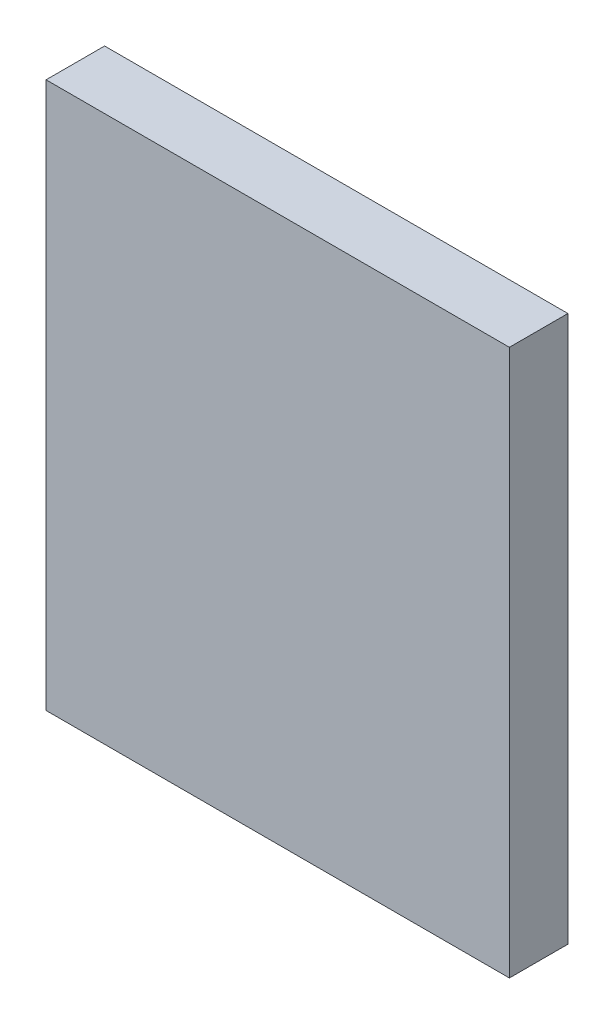
ISO-10303-21;
HEADER;
FILE_DESCRIPTION(('STEP AP214'),'2;1');
FILE_NAME('part.step','',(''),(''),'','','');
FILE_SCHEMA(('AUTOMOTIVE_DESIGN { 1 0 10303 214 1 1 1 1 }'));
ENDSEC;
DATA;
#1=APPLICATION_CONTEXT('core data for automotive mechanical design processes');
#2=APPLICATION_PROTOCOL_DEFINITION('international standard','automotive_design',2000,#1);
#3=PRODUCT_CONTEXT('',#1,'mechanical');
#4=PRODUCT('Part','Part','',(#3));
#5=PRODUCT_RELATED_PRODUCT_CATEGORY('part','',(#4));
#6=PRODUCT_DEFINITION_FORMATION('','',#4);
#7=PRODUCT_DEFINITION_CONTEXT('part definition',#1,'design');
#8=PRODUCT_DEFINITION('design','',#6,#7);
#9=PRODUCT_DEFINITION_SHAPE('','',#8);
#10=(LENGTH_UNIT() NAMED_UNIT(*) SI_UNIT(.MILLI.,.METRE.));
#11=(NAMED_UNIT(*) PLANE_ANGLE_UNIT() SI_UNIT($,.RADIAN.));
#12=(NAMED_UNIT(*) SI_UNIT($,.STERADIAN.) SOLID_ANGLE_UNIT());
#13=UNCERTAINTY_MEASURE_WITH_UNIT(LENGTH_MEASURE(1.E-05),#10,'distance_accuracy_value','');
#14=(GEOMETRIC_REPRESENTATION_CONTEXT(3) GLOBAL_UNCERTAINTY_ASSIGNED_CONTEXT((#13)) GLOBAL_UNIT_ASSIGNED_CONTEXT((#10,
#11,#12)) REPRESENTATION_CONTEXT('',''));
#15=CARTESIAN_POINT('',(0.,0.,0.));
#16=DIRECTION('',(0.,0.,1.));
#17=DIRECTION('',(1.,0.,0.));
#18=AXIS2_PLACEMENT_3D('',#15,#16,#17);
#19=CARTESIAN_POINT('',(0.,0.,1.2));
#20=DIRECTION('',(1.,0.,0.));
#21=DIRECTION('',(0.,0.,-1.));
#22=AXIS2_PLACEMENT_3D('',#19,#20,#21);
#23=PLANE('',#22);
#24=DIRECTION('',(0.,-1.,0.));
#25=VECTOR('',#24,1.);
#26=CARTESIAN_POINT('',(0.,0.,0.));
#27=LINE('',#26,#25);
#28=CARTESIAN_POINT('',(0.,11.2,0.));
#29=VERTEX_POINT('',#28);
#30=CARTESIAN_POINT('',(0.,0.,0.));
#31=VERTEX_POINT('',#30);
#32=EDGE_CURVE('E95',#29,#31,#27,.T.);
#33=ORIENTED_EDGE('',*,*,#32,.T.);
#34=DIRECTION('',(0.,0.,-1.));
#35=VECTOR('',#34,1.);
#36=CARTESIAN_POINT('',(0.,0.,1.2));
#37=LINE('',#36,#35);
#38=CARTESIAN_POINT('',(0.,0.,1.2));
#39=VERTEX_POINT('',#38);
#40=EDGE_CURVE('E11',#39,#31,#37,.T.);
#41=ORIENTED_EDGE('',*,*,#40,.F.);
#42=DIRECTION('',(0.,-1.,0.));
#43=VECTOR('',#42,1.);
#44=CARTESIAN_POINT('',(0.,0.,1.2));
#45=LINE('',#44,#43);
#46=CARTESIAN_POINT('',(0.,11.2,1.2));
#47=VERTEX_POINT('',#46);
#48=EDGE_CURVE('E83',#47,#39,#45,.T.);
#49=ORIENTED_EDGE('',*,*,#48,.F.);
#50=DIRECTION('',(0.,0.,-1.));
#51=VECTOR('',#50,1.);
#52=CARTESIAN_POINT('',(0.,11.2,1.2));
#53=LINE('',#52,#51);
#54=EDGE_CURVE('E91',#47,#29,#53,.T.);
#55=ORIENTED_EDGE('',*,*,#54,.T.);
#56=EDGE_LOOP('',(#33,#41,#49,#55));
#57=FACE_BOUND('',#56,.T.);
#58=ADVANCED_FACE('F32',(#57),#23,.F.);
#59=CARTESIAN_POINT('',(0.,0.,1.2));
#60=DIRECTION('',(0.,1.,0.));
#61=DIRECTION('',(0.,0.,1.));
#62=AXIS2_PLACEMENT_3D('',#59,#60,#61);
#63=PLANE('',#62);
#64=DIRECTION('',(1.,0.,0.));
#65=VECTOR('',#64,1.);
#66=CARTESIAN_POINT('',(0.,0.,0.));
#67=LINE('',#66,#65);
#68=CARTESIAN_POINT('',(9.5,0.,0.));
#69=VERTEX_POINT('',#68);
#70=EDGE_CURVE('E87',#31,#69,#67,.T.);
#71=ORIENTED_EDGE('',*,*,#70,.T.);
#72=DIRECTION('',(0.,0.,-1.));
#73=VECTOR('',#72,1.);
#74=CARTESIAN_POINT('',(9.5,0.,1.2));
#75=LINE('',#74,#73);
#76=CARTESIAN_POINT('',(9.5,0.,1.2));
#77=VERTEX_POINT('',#76);
#78=EDGE_CURVE('E40',#77,#69,#75,.T.);
#79=ORIENTED_EDGE('',*,*,#78,.F.);
#80=DIRECTION('',(1.,0.,0.));
#81=VECTOR('',#80,1.);
#82=CARTESIAN_POINT('',(0.,0.,1.2));
#83=LINE('',#82,#81);
#84=EDGE_CURVE('E78',#39,#77,#83,.T.);
#85=ORIENTED_EDGE('',*,*,#84,.F.);
#86=ORIENTED_EDGE('',*,*,#40,.T.);
#87=EDGE_LOOP('',(#71,#79,#85,#86));
#88=FACE_BOUND('',#87,.T.);
#89=ADVANCED_FACE('F86',(#88),#63,.F.);
#90=CARTESIAN_POINT('',(9.5,0.,1.2));
#91=DIRECTION('',(-1.,0.,0.));
#92=DIRECTION('',(0.,0.,1.));
#93=AXIS2_PLACEMENT_3D('',#90,#91,#92);
#94=PLANE('',#93);
#95=DIRECTION('',(0.,1.,0.));
#96=VECTOR('',#95,1.);
#97=CARTESIAN_POINT('',(9.5,0.,0.));
#98=LINE('',#97,#96);
#99=CARTESIAN_POINT('',(9.5,11.2,0.));
#100=VERTEX_POINT('',#99);
#101=EDGE_CURVE('E65',#69,#100,#98,.T.);
#102=ORIENTED_EDGE('',*,*,#101,.T.);
#103=DIRECTION('',(0.,0.,-1.));
#104=VECTOR('',#103,1.);
#105=CARTESIAN_POINT('',(9.5,11.2,1.2));
#106=LINE('',#105,#104);
#107=CARTESIAN_POINT('',(9.5,11.2,1.2));
#108=VERTEX_POINT('',#107);
#109=EDGE_CURVE('E88',#108,#100,#106,.T.);
#110=ORIENTED_EDGE('',*,*,#109,.F.);
#111=DIRECTION('',(0.,1.,0.));
#112=VECTOR('',#111,1.);
#113=CARTESIAN_POINT('',(9.5,0.,1.2));
#114=LINE('',#113,#112);
#115=EDGE_CURVE('E81',#77,#108,#114,.T.);
#116=ORIENTED_EDGE('',*,*,#115,.F.);
#117=ORIENTED_EDGE('',*,*,#78,.T.);
#118=EDGE_LOOP('',(#102,#110,#116,#117));
#119=FACE_BOUND('',#118,.T.);
#120=ADVANCED_FACE('F89',(#119),#94,.F.);
#121=CARTESIAN_POINT('',(0.,11.2,1.2));
#122=DIRECTION('',(0.,-1.,0.));
#123=DIRECTION('',(0.,0.,-1.));
#124=AXIS2_PLACEMENT_3D('',#121,#122,#123);
#125=PLANE('',#124);
#126=DIRECTION('',(-1.,0.,0.));
#127=VECTOR('',#126,1.);
#128=CARTESIAN_POINT('',(0.,11.2,0.));
#129=LINE('',#128,#127);
#130=EDGE_CURVE('E71',#100,#29,#129,.T.);
#131=ORIENTED_EDGE('',*,*,#130,.T.);
#132=ORIENTED_EDGE('',*,*,#54,.F.);
#133=DIRECTION('',(-1.,0.,0.));
#134=VECTOR('',#133,1.);
#135=CARTESIAN_POINT('',(0.,11.2,1.2));
#136=LINE('',#135,#134);
#137=EDGE_CURVE('E48',#108,#47,#136,.T.);
#138=ORIENTED_EDGE('',*,*,#137,.F.);
#139=ORIENTED_EDGE('',*,*,#109,.T.);
#140=EDGE_LOOP('',(#131,#132,#138,#139));
#141=FACE_BOUND('',#140,.T.);
#142=ADVANCED_FACE('F102',(#141),#125,.F.);
#143=CARTESIAN_POINT('',(0.,0.,1.2));
#144=DIRECTION('',(0.,0.,-1.));
#145=DIRECTION('',(-1.,0.,0.));
#146=AXIS2_PLACEMENT_3D('',#143,#144,#145);
#147=PLANE('',#146);
#148=ORIENTED_EDGE('',*,*,#48,.T.);
#149=ORIENTED_EDGE('',*,*,#84,.T.);
#150=ORIENTED_EDGE('',*,*,#115,.T.);
#151=ORIENTED_EDGE('',*,*,#137,.T.);
#152=EDGE_LOOP('',(#148,#149,#150,#151));
#153=FACE_BOUND('',#152,.T.);
#154=ADVANCED_FACE('F79',(#153),#147,.F.);
#155=CARTESIAN_POINT('',(0.,0.,0.));
#156=DIRECTION('',(0.,0.,-1.));
#157=DIRECTION('',(-1.,0.,0.));
#158=AXIS2_PLACEMENT_3D('',#155,#156,#157);
#159=PLANE('',#158);
#160=ORIENTED_EDGE('',*,*,#32,.F.);
#161=ORIENTED_EDGE('',*,*,#130,.F.);
#162=ORIENTED_EDGE('',*,*,#101,.F.);
#163=ORIENTED_EDGE('',*,*,#70,.F.);
#164=EDGE_LOOP('',(#160,#161,#162,#163));
#165=FACE_BOUND('',#164,.T.);
#166=ADVANCED_FACE('F105',(#165),#159,.T.);
#167=CLOSED_SHELL('',(#58,#89,#120,#142,#154,#166));
#168=MANIFOLD_SOLID_BREP('B2',#167);
#169=ADVANCED_BREP_SHAPE_REPRESENTATION('',(#18,#168),#14);
#170=SHAPE_DEFINITION_REPRESENTATION(#9,#169);
ENDSEC;
END-ISO-10303-21;
